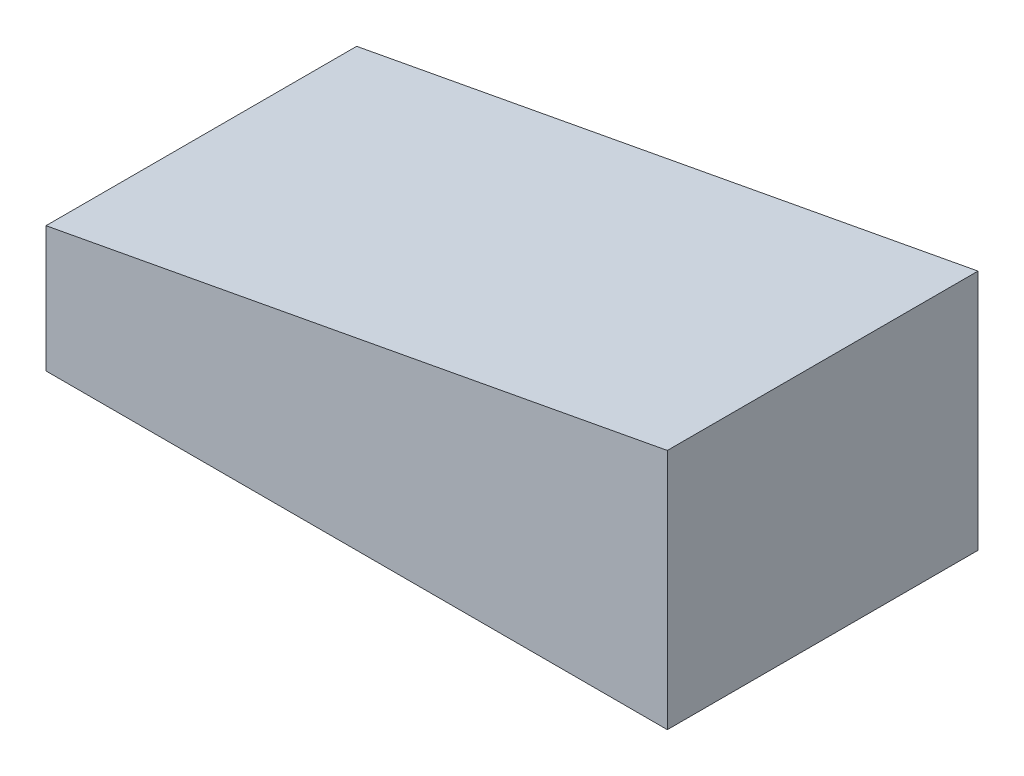
ISO-10303-21;
HEADER;
FILE_DESCRIPTION(('STEP AP214'),'2;1');
FILE_NAME('part.step','',(''),(''),'','','');
FILE_SCHEMA(('AUTOMOTIVE_DESIGN { 1 0 10303 214 1 1 1 1 }'));
ENDSEC;
DATA;
#1=APPLICATION_CONTEXT('core data for automotive mechanical design processes');
#2=APPLICATION_PROTOCOL_DEFINITION('international standard','automotive_design',2000,#1);
#3=PRODUCT_CONTEXT('',#1,'mechanical');
#4=PRODUCT('Part','Part','',(#3));
#5=PRODUCT_RELATED_PRODUCT_CATEGORY('part','',(#4));
#6=PRODUCT_DEFINITION_FORMATION('','',#4);
#7=PRODUCT_DEFINITION_CONTEXT('part definition',#1,'design');
#8=PRODUCT_DEFINITION('design','',#6,#7);
#9=PRODUCT_DEFINITION_SHAPE('','',#8);
#10=(LENGTH_UNIT() NAMED_UNIT(*) SI_UNIT(.MILLI.,.METRE.));
#11=(NAMED_UNIT(*) PLANE_ANGLE_UNIT() SI_UNIT($,.RADIAN.));
#12=(NAMED_UNIT(*) SI_UNIT($,.STERADIAN.) SOLID_ANGLE_UNIT());
#13=UNCERTAINTY_MEASURE_WITH_UNIT(LENGTH_MEASURE(1.E-05),#10,'distance_accuracy_value','');
#14=(GEOMETRIC_REPRESENTATION_CONTEXT(3) GLOBAL_UNCERTAINTY_ASSIGNED_CONTEXT((#13)) GLOBAL_UNIT_ASSIGNED_CONTEXT((#10,
#11,#12)) REPRESENTATION_CONTEXT('',''));
#15=CARTESIAN_POINT('',(0.,0.,0.));
#16=DIRECTION('',(0.,0.,1.));
#17=DIRECTION('',(1.,0.,0.));
#18=AXIS2_PLACEMENT_3D('',#15,#16,#17);
#19=CARTESIAN_POINT('',(16.4819672131147,0.,7.9));
#20=DIRECTION('',(-1.,0.,0.));
#21=DIRECTION('',(0.,0.,1.));
#22=AXIS2_PLACEMENT_3D('',#19,#20,#21);
#23=PLANE('',#22);
#24=DIRECTION('',(0.,-1.,0.));
#25=VECTOR('',#24,1.);
#26=CARTESIAN_POINT('',(16.4819672131147,35.7679015680186,0.));
#27=LINE('',#26,#25);
#28=CARTESIAN_POINT('',(16.4819672131147,6.15,0.));
#29=VERTEX_POINT('',#28);
#30=CARTESIAN_POINT('',(16.4819672131147,0.,0.));
#31=VERTEX_POINT('',#30);
#32=EDGE_CURVE('E108',#29,#31,#27,.T.);
#33=ORIENTED_EDGE('',*,*,#32,.F.);
#34=DIRECTION('',(0.,0.,1.));
#35=VECTOR('',#34,1.);
#36=CARTESIAN_POINT('',(16.4819672131147,6.15,0.));
#37=LINE('',#36,#35);
#38=CARTESIAN_POINT('',(16.4819672131147,6.15,7.9));
#39=VERTEX_POINT('',#38);
#40=EDGE_CURVE('E112',#29,#39,#37,.T.);
#41=ORIENTED_EDGE('',*,*,#40,.T.);
#42=DIRECTION('',(0.,1.,0.));
#43=VECTOR('',#42,1.);
#44=CARTESIAN_POINT('',(16.4819672131147,0.,7.9));
#45=LINE('',#44,#43);
#46=CARTESIAN_POINT('',(16.4819672131147,0.,7.9));
#47=VERTEX_POINT('',#46);
#48=EDGE_CURVE('E174',#47,#39,#45,.T.);
#49=ORIENTED_EDGE('',*,*,#48,.F.);
#50=DIRECTION('',(0.,0.,-1.));
#51=VECTOR('',#50,1.);
#52=CARTESIAN_POINT('',(16.4819672131147,0.,7.9));
#53=LINE('',#52,#51);
#54=EDGE_CURVE('E114',#47,#31,#53,.T.);
#55=ORIENTED_EDGE('',*,*,#54,.T.);
#56=EDGE_LOOP('',(#33,#41,#49,#55));
#57=FACE_BOUND('',#56,.T.);
#58=ADVANCED_FACE('F41',(#57),#23,.F.);
#59=CARTESIAN_POINT('',(0.681967213114738,0.,7.9));
#60=DIRECTION('',(0.,1.,0.));
#61=DIRECTION('',(0.,0.,1.));
#62=AXIS2_PLACEMENT_3D('',#59,#60,#61);
#63=PLANE('',#62);
#64=DIRECTION('',(0.,0.,-1.));
#65=VECTOR('',#64,1.);
#66=CARTESIAN_POINT('',(0.681967213114738,0.,7.9));
#67=LINE('',#66,#65);
#68=CARTESIAN_POINT('',(0.681967213114738,0.,7.9));
#69=VERTEX_POINT('',#68);
#70=CARTESIAN_POINT('',(0.681967213114738,0.,0.));
#71=VERTEX_POINT('',#70);
#72=EDGE_CURVE('E50',#69,#71,#67,.T.);
#73=ORIENTED_EDGE('',*,*,#72,.T.);
#74=DIRECTION('',(-1.,0.,0.));
#75=VECTOR('',#74,1.);
#76=CARTESIAN_POINT('',(0.681967213114738,0.,0.));
#77=LINE('',#76,#75);
#78=EDGE_CURVE('E118',#31,#71,#77,.T.);
#79=ORIENTED_EDGE('',*,*,#78,.F.);
#80=ORIENTED_EDGE('',*,*,#54,.F.);
#81=DIRECTION('',(1.,0.,0.));
#82=VECTOR('',#81,1.);
#83=CARTESIAN_POINT('',(0.681967213114738,0.,7.9));
#84=LINE('',#83,#82);
#85=EDGE_CURVE('E172',#69,#47,#84,.T.);
#86=ORIENTED_EDGE('',*,*,#85,.F.);
#87=EDGE_LOOP('',(#73,#79,#80,#86));
#88=FACE_BOUND('',#87,.T.);
#89=DIRECTION('',(-1.,0.,0.));
#90=VECTOR('',#89,1.);
#91=CARTESIAN_POINT('',(7.38292019553601,0.,1.19904701757875));
#92=LINE('',#91,#90);
#93=CARTESIAN_POINT('',(15.2819672131147,0.,1.19904701757875));
#94=VERTEX_POINT('',#93);
#95=CARTESIAN_POINT('',(1.88196721311474,0.,1.19904701757875));
#96=VERTEX_POINT('',#95);
#97=EDGE_CURVE('E147',#94,#96,#92,.T.);
#98=ORIENTED_EDGE('',*,*,#97,.T.);
#99=DIRECTION('',(0.,0.,-1.));
#100=VECTOR('',#99,1.);
#101=CARTESIAN_POINT('',(1.88196721311474,0.,7.9));
#102=LINE('',#101,#100);
#103=CARTESIAN_POINT('',(1.88196721311474,0.,6.7));
#104=VERTEX_POINT('',#103);
#105=EDGE_CURVE('E164',#104,#96,#102,.T.);
#106=ORIENTED_EDGE('',*,*,#105,.F.);
#107=DIRECTION('',(1.,0.,0.));
#108=VECTOR('',#107,1.);
#109=CARTESIAN_POINT('',(0.,0.,6.7));
#110=LINE('',#109,#108);
#111=CARTESIAN_POINT('',(15.2819672131147,0.,6.7));
#112=VERTEX_POINT('',#111);
#113=EDGE_CURVE('E154',#104,#112,#110,.T.);
#114=ORIENTED_EDGE('',*,*,#113,.T.);
#115=DIRECTION('',(0.,0.,-1.));
#116=VECTOR('',#115,1.);
#117=CARTESIAN_POINT('',(15.2819672131147,0.,7.9));
#118=LINE('',#117,#116);
#119=EDGE_CURVE('E162',#112,#94,#118,.T.);
#120=ORIENTED_EDGE('',*,*,#119,.T.);
#121=EDGE_LOOP('',(#98,#106,#114,#120));
#122=FACE_BOUND('',#121,.T.);
#123=ADVANCED_FACE('F181',(#88,#122),#63,.F.);
#124=CARTESIAN_POINT('',(15.2819672131147,0.,7.9));
#125=DIRECTION('',(-1.,0.,0.));
#126=DIRECTION('',(0.,0.,1.));
#127=AXIS2_PLACEMENT_3D('',#124,#125,#126);
#128=PLANE('',#127);
#129=DIRECTION('',(0.,-1.,0.));
#130=VECTOR('',#129,1.);
#131=CARTESIAN_POINT('',(15.2819672131147,2.,1.19904701757875));
#132=LINE('',#131,#130);
#133=CARTESIAN_POINT('',(15.2819672131147,2.,1.19904701757875));
#134=VERTEX_POINT('',#133);
#135=EDGE_CURVE('E57',#134,#94,#132,.T.);
#136=ORIENTED_EDGE('',*,*,#135,.T.);
#137=ORIENTED_EDGE('',*,*,#119,.F.);
#138=DIRECTION('',(0.,1.,0.));
#139=VECTOR('',#138,1.);
#140=CARTESIAN_POINT('',(15.2819672131147,0.,6.7));
#141=LINE('',#140,#139);
#142=CARTESIAN_POINT('',(15.2819672131147,2.,6.7));
#143=VERTEX_POINT('',#142);
#144=EDGE_CURVE('E160',#112,#143,#141,.T.);
#145=ORIENTED_EDGE('',*,*,#144,.T.);
#146=DIRECTION('',(0.,0.,-1.));
#147=VECTOR('',#146,1.);
#148=CARTESIAN_POINT('',(15.2819672131147,2.,7.9));
#149=LINE('',#148,#147);
#150=EDGE_CURVE('E157',#143,#134,#149,.T.);
#151=ORIENTED_EDGE('',*,*,#150,.T.);
#152=EDGE_LOOP('',(#136,#137,#145,#151));
#153=FACE_BOUND('',#152,.T.);
#154=ADVANCED_FACE('F205',(#153),#128,.T.);
#155=CARTESIAN_POINT('',(0.681967213114738,2.,7.9));
#156=DIRECTION('',(0.,-1.,0.));
#157=DIRECTION('',(1.,0.,0.));
#158=AXIS2_PLACEMENT_3D('',#155,#156,#157);
#159=PLANE('',#158);
#160=CARTESIAN_POINT('',(8.58196721311474,2.,4.));
#161=DIRECTION('',(0.,-1.,0.));
#162=DIRECTION('',(1.,0.,0.));
#163=AXIS2_PLACEMENT_3D('',#160,#161,#162);
#164=CIRCLE('',#163,1.25);
#165=CARTESIAN_POINT('',(9.83196721311474,2.,4.));
#166=VERTEX_POINT('',#165);
#167=EDGE_CURVE('E45',#166,#166,#164,.F.);
#168=ORIENTED_EDGE('',*,*,#167,.T.);
#169=EDGE_LOOP('',(#168));
#170=FACE_BOUND('',#169,.T.);
#171=DIRECTION('',(0.,0.,-1.));
#172=VECTOR('',#171,1.);
#173=CARTESIAN_POINT('',(1.88196721311474,2.,7.9));
#174=LINE('',#173,#172);
#175=CARTESIAN_POINT('',(1.88196721311474,2.,6.7));
#176=VERTEX_POINT('',#175);
#177=CARTESIAN_POINT('',(1.88196721311474,2.,1.19904701757875));
#178=VERTEX_POINT('',#177);
#179=EDGE_CURVE('E155',#176,#178,#174,.T.);
#180=ORIENTED_EDGE('',*,*,#179,.T.);
#181=DIRECTION('',(-1.,0.,0.));
#182=VECTOR('',#181,1.);
#183=CARTESIAN_POINT('',(7.38292019553601,2.,1.19904701757875));
#184=LINE('',#183,#182);
#185=EDGE_CURVE('E65',#134,#178,#184,.T.);
#186=ORIENTED_EDGE('',*,*,#185,.F.);
#187=ORIENTED_EDGE('',*,*,#150,.F.);
#188=DIRECTION('',(-1.,0.,0.));
#189=VECTOR('',#188,1.);
#190=CARTESIAN_POINT('',(0.,2.,6.7));
#191=LINE('',#190,#189);
#192=EDGE_CURVE('E158',#143,#176,#191,.T.);
#193=ORIENTED_EDGE('',*,*,#192,.T.);
#194=EDGE_LOOP('',(#180,#186,#187,#193));
#195=FACE_BOUND('',#194,.T.);
#196=ADVANCED_FACE('F197',(#170,#195),#159,.T.);
#197=CARTESIAN_POINT('',(0.681967213114738,0.,7.9));
#198=DIRECTION('',(1.,0.,0.));
#199=DIRECTION('',(0.,0.,-1.));
#200=AXIS2_PLACEMENT_3D('',#197,#198,#199);
#201=PLANE('',#200);
#202=DIRECTION('',(0.,-1.,0.));
#203=VECTOR('',#202,1.);
#204=CARTESIAN_POINT('',(0.681967213114738,0.,7.9));
#205=LINE('',#204,#203);
#206=CARTESIAN_POINT('',(0.681967213114738,3.2,7.9));
#207=VERTEX_POINT('',#206);
#208=EDGE_CURVE('E167',#207,#69,#205,.T.);
#209=ORIENTED_EDGE('',*,*,#208,.F.);
#210=DIRECTION('',(0.,0.,1.));
#211=VECTOR('',#210,1.);
#212=CARTESIAN_POINT('',(0.681967213114738,3.2,0.));
#213=LINE('',#212,#211);
#214=CARTESIAN_POINT('',(0.681967213114738,3.2,0.));
#215=VERTEX_POINT('',#214);
#216=EDGE_CURVE('E133',#215,#207,#213,.T.);
#217=ORIENTED_EDGE('',*,*,#216,.F.);
#218=DIRECTION('',(0.,-1.,0.));
#219=VECTOR('',#218,1.);
#220=CARTESIAN_POINT('',(0.681967213114738,4.8,0.));
#221=LINE('',#220,#219);
#222=EDGE_CURVE('E123',#215,#71,#221,.T.);
#223=ORIENTED_EDGE('',*,*,#222,.T.);
#224=ORIENTED_EDGE('',*,*,#72,.F.);
#225=EDGE_LOOP('',(#209,#217,#223,#224));
#226=FACE_BOUND('',#225,.T.);
#227=ADVANCED_FACE('F43',(#226),#201,.F.);
#228=CARTESIAN_POINT('',(0.,0.,7.9));
#229=DIRECTION('',(0.,0.,-1.));
#230=DIRECTION('',(-1.,0.,0.));
#231=AXIS2_PLACEMENT_3D('',#228,#229,#230);
#232=PLANE('',#231);
#233=ORIENTED_EDGE('',*,*,#48,.T.);
#234=DIRECTION('',(-0.983012766210077,-0.183537193691122,0.));
#235=VECTOR('',#234,1.);
#236=CARTESIAN_POINT('',(0.681967213114738,3.2,7.9));
#237=LINE('',#236,#235);
#238=EDGE_CURVE('E131',#39,#207,#237,.T.);
#239=ORIENTED_EDGE('',*,*,#238,.T.);
#240=ORIENTED_EDGE('',*,*,#208,.T.);
#241=ORIENTED_EDGE('',*,*,#85,.T.);
#242=EDGE_LOOP('',(#233,#239,#240,#241));
#243=FACE_BOUND('',#242,.T.);
#244=ADVANCED_FACE('F185',(#243),#232,.F.);
#245=CARTESIAN_POINT('',(1.88196721311474,0.,7.9));
#246=DIRECTION('',(1.,0.,0.));
#247=DIRECTION('',(0.,0.,-1.));
#248=AXIS2_PLACEMENT_3D('',#245,#246,#247);
#249=PLANE('',#248);
#250=DIRECTION('',(0.,-1.,0.));
#251=VECTOR('',#250,1.);
#252=CARTESIAN_POINT('',(1.88196721311474,3.202,1.19904701757875));
#253=LINE('',#252,#251);
#254=EDGE_CURVE('E143',#178,#96,#253,.T.);
#255=ORIENTED_EDGE('',*,*,#254,.F.);
#256=ORIENTED_EDGE('',*,*,#179,.F.);
#257=DIRECTION('',(0.,-1.,0.));
#258=VECTOR('',#257,1.);
#259=CARTESIAN_POINT('',(1.88196721311474,0.,6.7));
#260=LINE('',#259,#258);
#261=EDGE_CURVE('E152',#176,#104,#260,.T.);
#262=ORIENTED_EDGE('',*,*,#261,.T.);
#263=ORIENTED_EDGE('',*,*,#105,.T.);
#264=EDGE_LOOP('',(#255,#256,#262,#263));
#265=FACE_BOUND('',#264,.T.);
#266=ADVANCED_FACE('F187',(#265),#249,.T.);
#267=CARTESIAN_POINT('',(0.,0.,6.7));
#268=DIRECTION('',(0.,0.,-1.));
#269=DIRECTION('',(-1.,0.,0.));
#270=AXIS2_PLACEMENT_3D('',#267,#268,#269);
#271=PLANE('',#270);
#272=ORIENTED_EDGE('',*,*,#261,.F.);
#273=ORIENTED_EDGE('',*,*,#192,.F.);
#274=ORIENTED_EDGE('',*,*,#144,.F.);
#275=ORIENTED_EDGE('',*,*,#113,.F.);
#276=EDGE_LOOP('',(#272,#273,#274,#275));
#277=FACE_BOUND('',#276,.T.);
#278=ADVANCED_FACE('F194',(#277),#271,.T.);
#279=CARTESIAN_POINT('',(8.58196721311474,35.7679015680186,0.));
#280=DIRECTION('',(0.,0.,-1.));
#281=DIRECTION('',(-1.,0.,0.));
#282=AXIS2_PLACEMENT_3D('',#279,#280,#281);
#283=PLANE('',#282);
#284=ORIENTED_EDGE('',*,*,#222,.F.);
#285=DIRECTION('',(-0.983012766210077,-0.183537193691122,0.));
#286=VECTOR('',#285,1.);
#287=CARTESIAN_POINT('',(0.681967213114738,3.2,0.));
#288=LINE('',#287,#286);
#289=EDGE_CURVE('E121',#29,#215,#288,.T.);
#290=ORIENTED_EDGE('',*,*,#289,.F.);
#291=ORIENTED_EDGE('',*,*,#32,.T.);
#292=ORIENTED_EDGE('',*,*,#78,.T.);
#293=EDGE_LOOP('',(#284,#290,#291,#292));
#294=FACE_BOUND('',#293,.T.);
#295=ADVANCED_FACE('F122',(#294),#283,.T.);
#296=CARTESIAN_POINT('',(7.38292019553601,2.,1.19904701757875));
#297=DIRECTION('',(0.,0.,1.));
#298=DIRECTION('',(1.,0.,0.));
#299=AXIS2_PLACEMENT_3D('',#296,#297,#298);
#300=PLANE('',#299);
#301=ORIENTED_EDGE('',*,*,#97,.F.);
#302=ORIENTED_EDGE('',*,*,#135,.F.);
#303=ORIENTED_EDGE('',*,*,#185,.T.);
#304=ORIENTED_EDGE('',*,*,#254,.T.);
#305=EDGE_LOOP('',(#301,#302,#303,#304));
#306=FACE_BOUND('',#305,.T.);
#307=ADVANCED_FACE('F223',(#306),#300,.T.);
#308=CARTESIAN_POINT('',(8.58196721311474,0.200000000000001,4.));
#309=DIRECTION('',(0.,-1.,0.));
#310=DIRECTION('',(1.,0.,0.));
#311=AXIS2_PLACEMENT_3D('',#308,#309,#310);
#312=PLANE('',#311);
#313=CARTESIAN_POINT('',(8.58196721311474,0.200000000000001,4.));
#314=DIRECTION('',(0.,-1.,0.));
#315=DIRECTION('',(1.,0.,0.));
#316=AXIS2_PLACEMENT_3D('',#313,#314,#315);
#317=CIRCLE('',#316,1.25);
#318=CARTESIAN_POINT('',(9.83196721311474,0.200000000000001,4.));
#319=VERTEX_POINT('',#318);
#320=EDGE_CURVE('E140',#319,#319,#317,.T.);
#321=ORIENTED_EDGE('',*,*,#320,.T.);
#322=EDGE_LOOP('',(#321));
#323=FACE_BOUND('',#322,.T.);
#324=CARTESIAN_POINT('',(8.58196721311474,0.200000000000001,4.));
#325=DIRECTION('',(0.,-1.,0.));
#326=DIRECTION('',(1.,0.,0.));
#327=AXIS2_PLACEMENT_3D('',#324,#325,#326);
#328=CIRCLE('',#327,0.75);
#329=CARTESIAN_POINT('',(9.33196721311474,0.200000000000001,4.));
#330=VERTEX_POINT('',#329);
#331=EDGE_CURVE('E137',#330,#330,#328,.T.);
#332=ORIENTED_EDGE('',*,*,#331,.F.);
#333=EDGE_LOOP('',(#332));
#334=FACE_BOUND('',#333,.T.);
#335=ADVANCED_FACE('F234',(#323,#334),#312,.T.);
#336=CARTESIAN_POINT('',(8.58196721311474,0.200000000000001,4.));
#337=DIRECTION('',(0.,1.,0.));
#338=DIRECTION('',(-1.,0.,0.));
#339=AXIS2_PLACEMENT_3D('',#336,#337,#338);
#340=CYLINDRICAL_SURFACE('',#339,1.25);
#341=ORIENTED_EDGE('',*,*,#167,.F.);
#342=EDGE_LOOP('',(#341));
#343=FACE_BOUND('',#342,.T.);
#344=ORIENTED_EDGE('',*,*,#320,.F.);
#345=EDGE_LOOP('',(#344));
#346=FACE_BOUND('',#345,.T.);
#347=ADVANCED_FACE('F240',(#343,#346),#340,.T.);
#348=CARTESIAN_POINT('',(8.58196721311474,0.200000000000001,4.));
#349=DIRECTION('',(0.,1.,0.));
#350=DIRECTION('',(-1.,0.,0.));
#351=AXIS2_PLACEMENT_3D('',#348,#349,#350);
#352=CYLINDRICAL_SURFACE('',#351,0.75);
#353=CARTESIAN_POINT('',(8.58196721311474,2.,4.));
#354=DIRECTION('',(0.,-1.,0.));
#355=DIRECTION('',(1.,0.,0.));
#356=AXIS2_PLACEMENT_3D('',#353,#354,#355);
#357=CIRCLE('',#356,0.75);
#358=CARTESIAN_POINT('',(9.33196721311474,2.,4.));
#359=VERTEX_POINT('',#358);
#360=EDGE_CURVE('E11',#359,#359,#357,.F.);
#361=ORIENTED_EDGE('',*,*,#360,.T.);
#362=EDGE_LOOP('',(#361));
#363=FACE_BOUND('',#362,.T.);
#364=ORIENTED_EDGE('',*,*,#331,.T.);
#365=EDGE_LOOP('',(#364));
#366=FACE_BOUND('',#365,.T.);
#367=ADVANCED_FACE('F245',(#363,#366),#352,.F.);
#368=ORIENTED_EDGE('',*,*,#360,.F.);
#369=EDGE_LOOP('',(#368));
#370=FACE_BOUND('',#369,.T.);
#371=ADVANCED_FACE('F217',(#370),#159,.T.);
#372=CARTESIAN_POINT('',(0.681967213114738,3.2,0.));
#373=DIRECTION('',(-0.183537193691122,0.983012766210077,0.));
#374=DIRECTION('',(-0.983012766210077,-0.183537193691122,0.));
#375=AXIS2_PLACEMENT_3D('',#372,#373,#374);
#376=PLANE('',#375);
#377=ORIENTED_EDGE('',*,*,#216,.T.);
#378=ORIENTED_EDGE('',*,*,#238,.F.);
#379=ORIENTED_EDGE('',*,*,#40,.F.);
#380=ORIENTED_EDGE('',*,*,#289,.T.);
#381=EDGE_LOOP('',(#377,#378,#379,#380));
#382=FACE_BOUND('',#381,.T.);
#383=ADVANCED_FACE('F129',(#382),#376,.T.);
#384=CLOSED_SHELL('',(#58,#123,#154,#196,#227,#244,#266,#278,#295,#307,#335,#347,#367,#371,#383));
#385=MANIFOLD_SOLID_BREP('B2',#384);
#386=ADVANCED_BREP_SHAPE_REPRESENTATION('',(#18,#385),#14);
#387=SHAPE_DEFINITION_REPRESENTATION(#9,#386);
ENDSEC;
END-ISO-10303-21;
